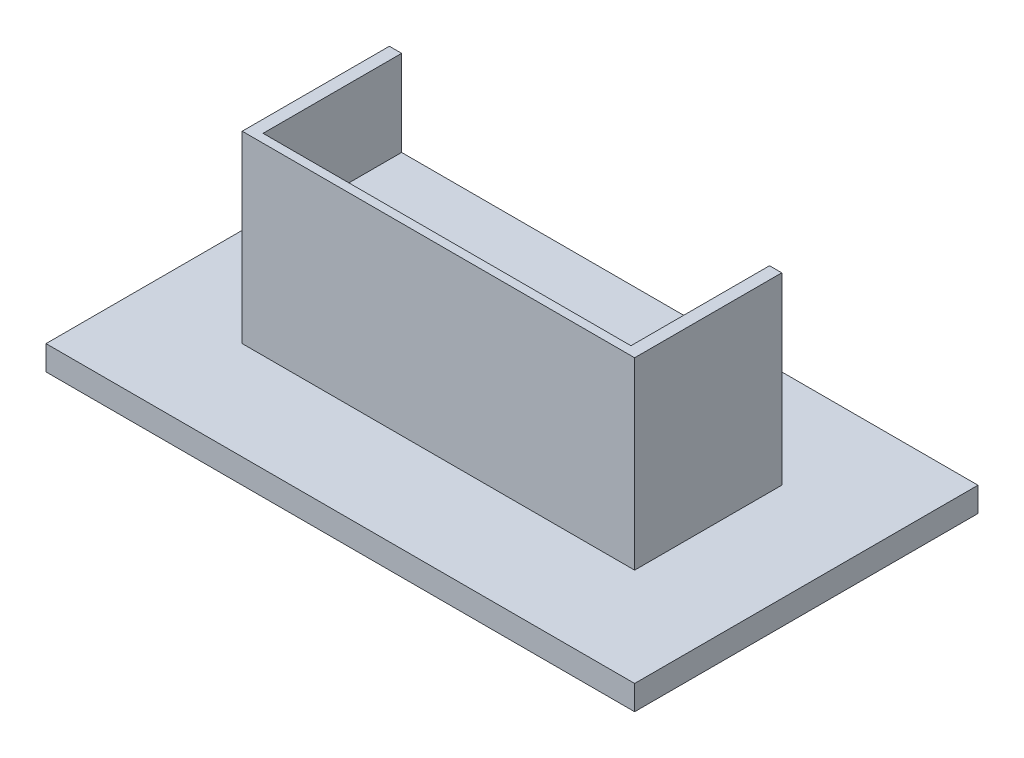
ISO-10303-21;
HEADER;
FILE_DESCRIPTION(('STEP AP214'),'2;1');
FILE_NAME('part.step','',(''),(''),'','','');
FILE_SCHEMA(('AUTOMOTIVE_DESIGN { 1 0 10303 214 1 1 1 1 }'));
ENDSEC;
DATA;
#1=APPLICATION_CONTEXT('core data for automotive mechanical design processes');
#2=APPLICATION_PROTOCOL_DEFINITION('international standard','automotive_design',2000,#1);
#3=PRODUCT_CONTEXT('',#1,'mechanical');
#4=PRODUCT('Part','Part','',(#3));
#5=PRODUCT_RELATED_PRODUCT_CATEGORY('part','',(#4));
#6=PRODUCT_DEFINITION_FORMATION('','',#4);
#7=PRODUCT_DEFINITION_CONTEXT('part definition',#1,'design');
#8=PRODUCT_DEFINITION('design','',#6,#7);
#9=PRODUCT_DEFINITION_SHAPE('','',#8);
#10=(LENGTH_UNIT() NAMED_UNIT(*) SI_UNIT(.MILLI.,.METRE.));
#11=(NAMED_UNIT(*) PLANE_ANGLE_UNIT() SI_UNIT($,.RADIAN.));
#12=(NAMED_UNIT(*) SI_UNIT($,.STERADIAN.) SOLID_ANGLE_UNIT());
#13=UNCERTAINTY_MEASURE_WITH_UNIT(LENGTH_MEASURE(1.E-05),#10,'distance_accuracy_value','');
#14=(GEOMETRIC_REPRESENTATION_CONTEXT(3) GLOBAL_UNCERTAINTY_ASSIGNED_CONTEXT((#13)) GLOBAL_UNIT_ASSIGNED_CONTEXT((#10,
#11,#12)) REPRESENTATION_CONTEXT('',''));
#15=CARTESIAN_POINT('',(0.,0.,0.));
#16=DIRECTION('',(0.,0.,1.));
#17=DIRECTION('',(1.,0.,0.));
#18=AXIS2_PLACEMENT_3D('',#15,#16,#17);
#19=CARTESIAN_POINT('',(0.,45000.,0.));
#20=DIRECTION('',(0.,-1.,0.));
#21=DIRECTION('',(0.,0.,-1.));
#22=AXIS2_PLACEMENT_3D('',#19,#20,#21);
#23=PLANE('',#22);
#24=DIRECTION('',(0.,0.,1.));
#25=VECTOR('',#24,1.);
#26=CARTESIAN_POINT('',(75000.,45000.,26500.));
#27=LINE('',#26,#25);
#28=CARTESIAN_POINT('',(75000.,45000.,-30000.));
#29=VERTEX_POINT('',#28);
#30=CARTESIAN_POINT('',(75000.,45000.,26500.));
#31=VERTEX_POINT('',#30);
#32=EDGE_CURVE('E130',#29,#31,#27,.T.);
#33=ORIENTED_EDGE('',*,*,#32,.F.);
#34=DIRECTION('',(-1.,0.,0.));
#35=VECTOR('',#34,1.);
#36=CARTESIAN_POINT('',(-80000.,45000.,-30000.));
#37=LINE('',#36,#35);
#38=CARTESIAN_POINT('',(-75000.,45000.,-30000.));
#39=VERTEX_POINT('',#38);
#40=EDGE_CURVE('E162',#29,#39,#37,.T.);
#41=ORIENTED_EDGE('',*,*,#40,.T.);
#42=DIRECTION('',(0.,0.,-1.));
#43=VECTOR('',#42,1.);
#44=CARTESIAN_POINT('',(-75000.,45000.,26500.));
#45=LINE('',#44,#43);
#46=CARTESIAN_POINT('',(-75000.,45000.,26500.));
#47=VERTEX_POINT('',#46);
#48=EDGE_CURVE('E137',#47,#39,#45,.T.);
#49=ORIENTED_EDGE('',*,*,#48,.F.);
#50=DIRECTION('',(-1.,0.,0.));
#51=VECTOR('',#50,1.);
#52=CARTESIAN_POINT('',(-80000.,45000.,26500.));
#53=LINE('',#52,#51);
#54=EDGE_CURVE('E144',#31,#47,#53,.T.);
#55=ORIENTED_EDGE('',*,*,#54,.F.);
#56=EDGE_LOOP('',(#33,#41,#49,#55));
#57=FACE_BOUND('',#56,.T.);
#58=ADVANCED_FACE('F43',(#57),#23,.F.);
#59=CARTESIAN_POINT('',(-80000.,80000.,26500.));
#60=DIRECTION('',(0.,0.,1.));
#61=DIRECTION('',(1.,0.,0.));
#62=AXIS2_PLACEMENT_3D('',#59,#60,#61);
#63=PLANE('',#62);
#64=DIRECTION('',(0.,-1.,0.));
#65=VECTOR('',#64,1.);
#66=CARTESIAN_POINT('',(75000.,80000.,26500.));
#67=LINE('',#66,#65);
#68=CARTESIAN_POINT('',(75000.,80000.,26500.));
#69=VERTEX_POINT('',#68);
#70=EDGE_CURVE('E58',#69,#31,#67,.T.);
#71=ORIENTED_EDGE('',*,*,#70,.T.);
#72=ORIENTED_EDGE('',*,*,#54,.T.);
#73=DIRECTION('',(0.,-1.,0.));
#74=VECTOR('',#73,1.);
#75=CARTESIAN_POINT('',(-75000.,80000.,26500.));
#76=LINE('',#75,#74);
#77=CARTESIAN_POINT('',(-75000.,80000.,26500.));
#78=VERTEX_POINT('',#77);
#79=EDGE_CURVE('E152',#78,#47,#76,.T.);
#80=ORIENTED_EDGE('',*,*,#79,.F.);
#81=DIRECTION('',(-1.,0.,0.));
#82=VECTOR('',#81,1.);
#83=CARTESIAN_POINT('',(-80000.,80000.,26500.));
#84=LINE('',#83,#82);
#85=EDGE_CURVE('E146',#69,#78,#84,.T.);
#86=ORIENTED_EDGE('',*,*,#85,.F.);
#87=EDGE_LOOP('',(#71,#72,#80,#86));
#88=FACE_BOUND('',#87,.T.);
#89=ADVANCED_FACE('F142',(#88),#63,.F.);
#90=CARTESIAN_POINT('',(-120000.,5000.,70000.));
#91=DIRECTION('',(0.,-1.,0.));
#92=DIRECTION('',(0.,0.,-1.));
#93=AXIS2_PLACEMENT_3D('',#90,#91,#92);
#94=PLANE('',#93);
#95=DIRECTION('',(0.,0.,-1.));
#96=VECTOR('',#95,1.);
#97=CARTESIAN_POINT('',(120000.,5000.,70000.));
#98=LINE('',#97,#96);
#99=CARTESIAN_POINT('',(120000.,5000.,70000.));
#100=VERTEX_POINT('',#99);
#101=CARTESIAN_POINT('',(120000.,5000.,-70000.));
#102=VERTEX_POINT('',#101);
#103=EDGE_CURVE('E11',#100,#102,#98,.T.);
#104=ORIENTED_EDGE('',*,*,#103,.T.);
#105=DIRECTION('',(-1.,0.,0.));
#106=VECTOR('',#105,1.);
#107=CARTESIAN_POINT('',(-120000.,5000.,-70000.));
#108=LINE('',#107,#106);
#109=CARTESIAN_POINT('',(-120000.,5000.,-70000.));
#110=VERTEX_POINT('',#109);
#111=EDGE_CURVE('E188',#102,#110,#108,.T.);
#112=ORIENTED_EDGE('',*,*,#111,.T.);
#113=DIRECTION('',(0.,0.,-1.));
#114=VECTOR('',#113,1.);
#115=CARTESIAN_POINT('',(-120000.,5000.,70000.));
#116=LINE('',#115,#114);
#117=CARTESIAN_POINT('',(-120000.,5000.,70000.));
#118=VERTEX_POINT('',#117);
#119=EDGE_CURVE('E51',#118,#110,#116,.T.);
#120=ORIENTED_EDGE('',*,*,#119,.F.);
#121=DIRECTION('',(-1.,0.,0.));
#122=VECTOR('',#121,1.);
#123=CARTESIAN_POINT('',(-120000.,5000.,70000.));
#124=LINE('',#123,#122);
#125=EDGE_CURVE('E200',#100,#118,#124,.T.);
#126=ORIENTED_EDGE('',*,*,#125,.F.);
#127=EDGE_LOOP('',(#104,#112,#120,#126));
#128=FACE_BOUND('',#127,.T.);
#129=DIRECTION('',(0.,0.,-1.));
#130=VECTOR('',#129,1.);
#131=CARTESIAN_POINT('',(80000.,5000.,30000.));
#132=LINE('',#131,#130);
#133=CARTESIAN_POINT('',(80000.,5000.,30000.));
#134=VERTEX_POINT('',#133);
#135=CARTESIAN_POINT('',(80000.,5000.,-30000.));
#136=VERTEX_POINT('',#135);
#137=EDGE_CURVE('E66',#134,#136,#132,.T.);
#138=ORIENTED_EDGE('',*,*,#137,.F.);
#139=DIRECTION('',(1.,0.,0.));
#140=VECTOR('',#139,1.);
#141=CARTESIAN_POINT('',(-80000.,5000.,30000.));
#142=LINE('',#141,#140);
#143=CARTESIAN_POINT('',(-80000.,5000.,30000.));
#144=VERTEX_POINT('',#143);
#145=EDGE_CURVE('E165',#144,#134,#142,.T.);
#146=ORIENTED_EDGE('',*,*,#145,.F.);
#147=DIRECTION('',(0.,0.,1.));
#148=VECTOR('',#147,1.);
#149=CARTESIAN_POINT('',(-80000.,5000.,30000.));
#150=LINE('',#149,#148);
#151=CARTESIAN_POINT('',(-80000.,5000.,-30000.));
#152=VERTEX_POINT('',#151);
#153=EDGE_CURVE('E170',#152,#144,#150,.T.);
#154=ORIENTED_EDGE('',*,*,#153,.F.);
#155=DIRECTION('',(-1.,0.,0.));
#156=VECTOR('',#155,1.);
#157=CARTESIAN_POINT('',(-80000.,5000.,-30000.));
#158=LINE('',#157,#156);
#159=EDGE_CURVE('E167',#136,#152,#158,.T.);
#160=ORIENTED_EDGE('',*,*,#159,.F.);
#161=EDGE_LOOP('',(#138,#146,#154,#160));
#162=FACE_BOUND('',#161,.T.);
#163=ADVANCED_FACE('F221',(#128,#162),#94,.F.);
#164=CARTESIAN_POINT('',(120000.,-5000.,70000.));
#165=DIRECTION('',(-1.,0.,0.));
#166=DIRECTION('',(0.,0.,1.));
#167=AXIS2_PLACEMENT_3D('',#164,#165,#166);
#168=PLANE('',#167);
#169=DIRECTION('',(0.,0.,-1.));
#170=VECTOR('',#169,1.);
#171=CARTESIAN_POINT('',(120000.,-5000.,70000.));
#172=LINE('',#171,#170);
#173=CARTESIAN_POINT('',(120000.,-5000.,70000.));
#174=VERTEX_POINT('',#173);
#175=CARTESIAN_POINT('',(120000.,-5000.,-70000.));
#176=VERTEX_POINT('',#175);
#177=EDGE_CURVE('E206',#174,#176,#172,.T.);
#178=ORIENTED_EDGE('',*,*,#177,.T.);
#179=DIRECTION('',(0.,1.,0.));
#180=VECTOR('',#179,1.);
#181=CARTESIAN_POINT('',(120000.,-5000.,-70000.));
#182=LINE('',#181,#180);
#183=EDGE_CURVE('E185',#176,#102,#182,.T.);
#184=ORIENTED_EDGE('',*,*,#183,.T.);
#185=ORIENTED_EDGE('',*,*,#103,.F.);
#186=DIRECTION('',(0.,1.,0.));
#187=VECTOR('',#186,1.);
#188=CARTESIAN_POINT('',(120000.,-5000.,70000.));
#189=LINE('',#188,#187);
#190=EDGE_CURVE('E197',#174,#100,#189,.T.);
#191=ORIENTED_EDGE('',*,*,#190,.F.);
#192=EDGE_LOOP('',(#178,#184,#185,#191));
#193=FACE_BOUND('',#192,.T.);
#194=ADVANCED_FACE('F45',(#193),#168,.F.);
#195=CARTESIAN_POINT('',(-120000.,-5000.,70000.));
#196=DIRECTION('',(1.,0.,0.));
#197=DIRECTION('',(0.,0.,-1.));
#198=AXIS2_PLACEMENT_3D('',#195,#196,#197);
#199=PLANE('',#198);
#200=ORIENTED_EDGE('',*,*,#119,.T.);
#201=DIRECTION('',(0.,-1.,0.));
#202=VECTOR('',#201,1.);
#203=CARTESIAN_POINT('',(-120000.,-5000.,-70000.));
#204=LINE('',#203,#202);
#205=CARTESIAN_POINT('',(-120000.,-5000.,-70000.));
#206=VERTEX_POINT('',#205);
#207=EDGE_CURVE('E191',#110,#206,#204,.T.);
#208=ORIENTED_EDGE('',*,*,#207,.T.);
#209=DIRECTION('',(0.,0.,-1.));
#210=VECTOR('',#209,1.);
#211=CARTESIAN_POINT('',(-120000.,-5000.,70000.));
#212=LINE('',#211,#210);
#213=CARTESIAN_POINT('',(-120000.,-5000.,70000.));
#214=VERTEX_POINT('',#213);
#215=EDGE_CURVE('E208',#214,#206,#212,.T.);
#216=ORIENTED_EDGE('',*,*,#215,.F.);
#217=DIRECTION('',(0.,-1.,0.));
#218=VECTOR('',#217,1.);
#219=CARTESIAN_POINT('',(-120000.,-5000.,70000.));
#220=LINE('',#219,#218);
#221=EDGE_CURVE('E202',#118,#214,#220,.T.);
#222=ORIENTED_EDGE('',*,*,#221,.F.);
#223=EDGE_LOOP('',(#200,#208,#216,#222));
#224=FACE_BOUND('',#223,.T.);
#225=ADVANCED_FACE('F213',(#224),#199,.F.);
#226=CARTESIAN_POINT('',(-120000.,-5000.,70000.));
#227=DIRECTION('',(0.,1.,0.));
#228=DIRECTION('',(0.,0.,1.));
#229=AXIS2_PLACEMENT_3D('',#226,#227,#228);
#230=PLANE('',#229);
#231=ORIENTED_EDGE('',*,*,#215,.T.);
#232=DIRECTION('',(1.,0.,0.));
#233=VECTOR('',#232,1.);
#234=CARTESIAN_POINT('',(-120000.,-5000.,-70000.));
#235=LINE('',#234,#233);
#236=EDGE_CURVE('E194',#206,#176,#235,.T.);
#237=ORIENTED_EDGE('',*,*,#236,.T.);
#238=ORIENTED_EDGE('',*,*,#177,.F.);
#239=DIRECTION('',(1.,0.,0.));
#240=VECTOR('',#239,1.);
#241=CARTESIAN_POINT('',(-120000.,-5000.,70000.));
#242=LINE('',#241,#240);
#243=EDGE_CURVE('E204',#214,#174,#242,.T.);
#244=ORIENTED_EDGE('',*,*,#243,.F.);
#245=EDGE_LOOP('',(#231,#237,#238,#244));
#246=FACE_BOUND('',#245,.T.);
#247=ADVANCED_FACE('F227',(#246),#230,.F.);
#248=CARTESIAN_POINT('',(0.,0.,70000.));
#249=DIRECTION('',(0.,0.,-1.));
#250=DIRECTION('',(-1.,0.,0.));
#251=AXIS2_PLACEMENT_3D('',#248,#249,#250);
#252=PLANE('',#251);
#253=ORIENTED_EDGE('',*,*,#190,.T.);
#254=ORIENTED_EDGE('',*,*,#125,.T.);
#255=ORIENTED_EDGE('',*,*,#221,.T.);
#256=ORIENTED_EDGE('',*,*,#243,.T.);
#257=EDGE_LOOP('',(#253,#254,#255,#256));
#258=FACE_BOUND('',#257,.T.);
#259=ADVANCED_FACE('F230',(#258),#252,.F.);
#260=CARTESIAN_POINT('',(0.,0.,-70000.));
#261=DIRECTION('',(0.,0.,-1.));
#262=DIRECTION('',(-1.,0.,0.));
#263=AXIS2_PLACEMENT_3D('',#260,#261,#262);
#264=PLANE('',#263);
#265=ORIENTED_EDGE('',*,*,#183,.F.);
#266=ORIENTED_EDGE('',*,*,#236,.F.);
#267=ORIENTED_EDGE('',*,*,#207,.F.);
#268=ORIENTED_EDGE('',*,*,#111,.F.);
#269=EDGE_LOOP('',(#265,#266,#267,#268));
#270=FACE_BOUND('',#269,.T.);
#271=ADVANCED_FACE('F220',(#270),#264,.T.);
#272=CARTESIAN_POINT('',(80000.,45000.,30000.));
#273=DIRECTION('',(-1.,0.,0.));
#274=DIRECTION('',(0.,0.,1.));
#275=AXIS2_PLACEMENT_3D('',#272,#273,#274);
#276=PLANE('',#275);
#277=ORIENTED_EDGE('',*,*,#137,.T.);
#278=DIRECTION('',(0.,-1.,0.));
#279=VECTOR('',#278,1.);
#280=CARTESIAN_POINT('',(80000.,45000.,-30000.));
#281=LINE('',#280,#279);
#282=CARTESIAN_POINT('',(80000.,80000.,-30000.));
#283=VERTEX_POINT('',#282);
#284=EDGE_CURVE('E182',#283,#136,#281,.T.);
#285=ORIENTED_EDGE('',*,*,#284,.F.);
#286=DIRECTION('',(0.,0.,-1.));
#287=VECTOR('',#286,1.);
#288=CARTESIAN_POINT('',(80000.,80000.,30000.));
#289=LINE('',#288,#287);
#290=CARTESIAN_POINT('',(80000.,80000.,30000.));
#291=VERTEX_POINT('',#290);
#292=EDGE_CURVE('E267',#291,#283,#289,.T.);
#293=ORIENTED_EDGE('',*,*,#292,.F.);
#294=DIRECTION('',(0.,-1.,0.));
#295=VECTOR('',#294,1.);
#296=CARTESIAN_POINT('',(80000.,45000.,30000.));
#297=LINE('',#296,#295);
#298=EDGE_CURVE('E164',#291,#134,#297,.T.);
#299=ORIENTED_EDGE('',*,*,#298,.T.);
#300=EDGE_LOOP('',(#277,#285,#293,#299));
#301=FACE_BOUND('',#300,.T.);
#302=ADVANCED_FACE('F237',(#301),#276,.F.);
#303=CARTESIAN_POINT('',(-80000.,45000.,-30000.));
#304=DIRECTION('',(0.,0.,1.));
#305=DIRECTION('',(1.,0.,0.));
#306=AXIS2_PLACEMENT_3D('',#303,#304,#305);
#307=PLANE('',#306);
#308=ORIENTED_EDGE('',*,*,#159,.T.);
#309=DIRECTION('',(0.,-1.,0.));
#310=VECTOR('',#309,1.);
#311=CARTESIAN_POINT('',(-80000.,45000.,-30000.));
#312=LINE('',#311,#310);
#313=CARTESIAN_POINT('',(-80000.,80000.,-30000.));
#314=VERTEX_POINT('',#313);
#315=EDGE_CURVE('E179',#314,#152,#312,.T.);
#316=ORIENTED_EDGE('',*,*,#315,.F.);
#317=DIRECTION('',(-1.,0.,0.));
#318=VECTOR('',#317,1.);
#319=CARTESIAN_POINT('',(-80000.,80000.,-30000.));
#320=LINE('',#319,#318);
#321=CARTESIAN_POINT('',(-75000.,80000.,-30000.));
#322=VERTEX_POINT('',#321);
#323=EDGE_CURVE('E278',#322,#314,#320,.T.);
#324=ORIENTED_EDGE('',*,*,#323,.F.);
#325=DIRECTION('',(0.,-1.,0.));
#326=VECTOR('',#325,1.);
#327=CARTESIAN_POINT('',(-75000.,80000.,-30000.));
#328=LINE('',#327,#326);
#329=EDGE_CURVE('E157',#322,#39,#328,.T.);
#330=ORIENTED_EDGE('',*,*,#329,.T.);
#331=ORIENTED_EDGE('',*,*,#40,.F.);
#332=DIRECTION('',(0.,-1.,0.));
#333=VECTOR('',#332,1.);
#334=CARTESIAN_POINT('',(75000.,80000.,-30000.));
#335=LINE('',#334,#333);
#336=CARTESIAN_POINT('',(75000.,80000.,-30000.));
#337=VERTEX_POINT('',#336);
#338=EDGE_CURVE('E133',#337,#29,#335,.T.);
#339=ORIENTED_EDGE('',*,*,#338,.F.);
#340=DIRECTION('',(-1.,0.,0.));
#341=VECTOR('',#340,1.);
#342=CARTESIAN_POINT('',(80000.,80000.,-30000.));
#343=LINE('',#342,#341);
#344=EDGE_CURVE('E138',#283,#337,#343,.T.);
#345=ORIENTED_EDGE('',*,*,#344,.F.);
#346=ORIENTED_EDGE('',*,*,#284,.T.);
#347=EDGE_LOOP('',(#308,#316,#324,#330,#331,#339,#345,#346));
#348=FACE_BOUND('',#347,.T.);
#349=ADVANCED_FACE('F256',(#348),#307,.F.);
#350=CARTESIAN_POINT('',(-80000.,45000.,30000.));
#351=DIRECTION('',(1.,0.,0.));
#352=DIRECTION('',(0.,0.,-1.));
#353=AXIS2_PLACEMENT_3D('',#350,#351,#352);
#354=PLANE('',#353);
#355=ORIENTED_EDGE('',*,*,#153,.T.);
#356=DIRECTION('',(0.,-1.,0.));
#357=VECTOR('',#356,1.);
#358=CARTESIAN_POINT('',(-80000.,45000.,30000.));
#359=LINE('',#358,#357);
#360=CARTESIAN_POINT('',(-80000.,80000.,30000.));
#361=VERTEX_POINT('',#360);
#362=EDGE_CURVE('E176',#361,#144,#359,.T.);
#363=ORIENTED_EDGE('',*,*,#362,.F.);
#364=DIRECTION('',(0.,0.,1.));
#365=VECTOR('',#364,1.);
#366=CARTESIAN_POINT('',(-80000.,80000.,30000.));
#367=LINE('',#366,#365);
#368=EDGE_CURVE('E151',#314,#361,#367,.T.);
#369=ORIENTED_EDGE('',*,*,#368,.F.);
#370=ORIENTED_EDGE('',*,*,#315,.T.);
#371=EDGE_LOOP('',(#355,#363,#369,#370));
#372=FACE_BOUND('',#371,.T.);
#373=ADVANCED_FACE('F252',(#372),#354,.F.);
#374=CARTESIAN_POINT('',(-80000.,45000.,30000.));
#375=DIRECTION('',(0.,0.,-1.));
#376=DIRECTION('',(-1.,0.,0.));
#377=AXIS2_PLACEMENT_3D('',#374,#375,#376);
#378=PLANE('',#377);
#379=ORIENTED_EDGE('',*,*,#145,.T.);
#380=ORIENTED_EDGE('',*,*,#298,.F.);
#381=DIRECTION('',(1.,0.,0.));
#382=VECTOR('',#381,1.);
#383=CARTESIAN_POINT('',(-80000.,80000.,30000.));
#384=LINE('',#383,#382);
#385=EDGE_CURVE('E155',#361,#291,#384,.T.);
#386=ORIENTED_EDGE('',*,*,#385,.F.);
#387=ORIENTED_EDGE('',*,*,#362,.T.);
#388=EDGE_LOOP('',(#379,#380,#386,#387));
#389=FACE_BOUND('',#388,.T.);
#390=ADVANCED_FACE('F249',(#389),#378,.F.);
#391=CARTESIAN_POINT('',(0.,80000.,0.));
#392=DIRECTION('',(0.,-1.,0.));
#393=DIRECTION('',(0.,0.,-1.));
#394=AXIS2_PLACEMENT_3D('',#391,#392,#393);
#395=PLANE('',#394);
#396=ORIENTED_EDGE('',*,*,#368,.T.);
#397=ORIENTED_EDGE('',*,*,#385,.T.);
#398=ORIENTED_EDGE('',*,*,#292,.T.);
#399=ORIENTED_EDGE('',*,*,#344,.T.);
#400=DIRECTION('',(0.,0.,1.));
#401=VECTOR('',#400,1.);
#402=CARTESIAN_POINT('',(75000.,80000.,26500.));
#403=LINE('',#402,#401);
#404=EDGE_CURVE('E147',#337,#69,#403,.T.);
#405=ORIENTED_EDGE('',*,*,#404,.T.);
#406=ORIENTED_EDGE('',*,*,#85,.T.);
#407=DIRECTION('',(0.,0.,-1.));
#408=VECTOR('',#407,1.);
#409=CARTESIAN_POINT('',(-75000.,80000.,26500.));
#410=LINE('',#409,#408);
#411=EDGE_CURVE('E280',#78,#322,#410,.T.);
#412=ORIENTED_EDGE('',*,*,#411,.T.);
#413=ORIENTED_EDGE('',*,*,#323,.T.);
#414=EDGE_LOOP('',(#396,#397,#398,#399,#405,#406,#412,#413));
#415=FACE_BOUND('',#414,.T.);
#416=ADVANCED_FACE('F251',(#415),#395,.F.);
#417=CARTESIAN_POINT('',(-75000.,80000.,26500.));
#418=DIRECTION('',(-1.,0.,0.));
#419=DIRECTION('',(0.,0.,1.));
#420=AXIS2_PLACEMENT_3D('',#417,#418,#419);
#421=PLANE('',#420);
#422=ORIENTED_EDGE('',*,*,#48,.T.);
#423=ORIENTED_EDGE('',*,*,#329,.F.);
#424=ORIENTED_EDGE('',*,*,#411,.F.);
#425=ORIENTED_EDGE('',*,*,#79,.T.);
#426=EDGE_LOOP('',(#422,#423,#424,#425));
#427=FACE_BOUND('',#426,.T.);
#428=ADVANCED_FACE('F289',(#427),#421,.F.);
#429=CARTESIAN_POINT('',(75000.,80000.,26500.));
#430=DIRECTION('',(1.,0.,0.));
#431=DIRECTION('',(0.,0.,-1.));
#432=AXIS2_PLACEMENT_3D('',#429,#430,#431);
#433=PLANE('',#432);
#434=ORIENTED_EDGE('',*,*,#32,.T.);
#435=ORIENTED_EDGE('',*,*,#70,.F.);
#436=ORIENTED_EDGE('',*,*,#404,.F.);
#437=ORIENTED_EDGE('',*,*,#338,.T.);
#438=EDGE_LOOP('',(#434,#435,#436,#437));
#439=FACE_BOUND('',#438,.T.);
#440=ADVANCED_FACE('F131',(#439),#433,.F.);
#441=CLOSED_SHELL('',(#58,#89,#163,#194,#225,#247,#259,#271,#302,#349,#373,#390,#416,#428,#440));
#442=MANIFOLD_SOLID_BREP('B2',#441);
#443=ADVANCED_BREP_SHAPE_REPRESENTATION('',(#18,#442),#14);
#444=SHAPE_DEFINITION_REPRESENTATION(#9,#443);
ENDSEC;
END-ISO-10303-21;
